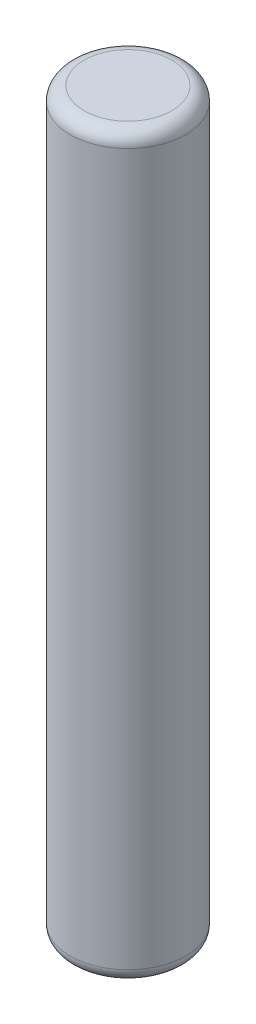
ISO-10303-21;
HEADER;
FILE_DESCRIPTION(('STEP AP214'),'2;1');
FILE_NAME('part.step','',(''),(''),'','','');
FILE_SCHEMA(('AUTOMOTIVE_DESIGN { 1 0 10303 214 1 1 1 1 }'));
ENDSEC;
DATA;
#1=APPLICATION_CONTEXT('core data for automotive mechanical design processes');
#2=APPLICATION_PROTOCOL_DEFINITION('international standard','automotive_design',2000,#1);
#3=PRODUCT_CONTEXT('',#1,'mechanical');
#4=PRODUCT('Part','Part','',(#3));
#5=PRODUCT_RELATED_PRODUCT_CATEGORY('part','',(#4));
#6=PRODUCT_DEFINITION_FORMATION('','',#4);
#7=PRODUCT_DEFINITION_CONTEXT('part definition',#1,'design');
#8=PRODUCT_DEFINITION('design','',#6,#7);
#9=PRODUCT_DEFINITION_SHAPE('','',#8);
#10=(LENGTH_UNIT() NAMED_UNIT(*) SI_UNIT(.MILLI.,.METRE.));
#11=(NAMED_UNIT(*) PLANE_ANGLE_UNIT() SI_UNIT($,.RADIAN.));
#12=(NAMED_UNIT(*) SI_UNIT($,.STERADIAN.) SOLID_ANGLE_UNIT());
#13=UNCERTAINTY_MEASURE_WITH_UNIT(LENGTH_MEASURE(1.E-05),#10,'distance_accuracy_value','');
#14=(GEOMETRIC_REPRESENTATION_CONTEXT(3) GLOBAL_UNCERTAINTY_ASSIGNED_CONTEXT((#13)) GLOBAL_UNIT_ASSIGNED_CONTEXT((#10,
#11,#12)) REPRESENTATION_CONTEXT('',''));
#15=CARTESIAN_POINT('',(0.,0.,0.));
#16=DIRECTION('',(0.,0.,1.));
#17=DIRECTION('',(1.,0.,0.));
#18=AXIS2_PLACEMENT_3D('',#15,#16,#17);
#19=CARTESIAN_POINT('',(0.,16.,0.));
#20=DIRECTION('',(0.,-1.,0.));
#21=DIRECTION('',(0.,0.,-1.));
#22=AXIS2_PLACEMENT_3D('',#19,#20,#21);
#23=CYLINDRICAL_SURFACE('',#22,1.25);
#24=CARTESIAN_POINT('',(0.,0.300000000000002,0.));
#25=DIRECTION('',(0.,1.,0.));
#26=DIRECTION('',(0.,0.,1.));
#27=AXIS2_PLACEMENT_3D('',#24,#25,#26);
#28=CIRCLE('',#27,1.25);
#29=CARTESIAN_POINT('',(0.,0.300000000000002,1.25));
#30=VERTEX_POINT('',#29);
#31=EDGE_CURVE('E42',#30,#30,#28,.T.);
#32=ORIENTED_EDGE('',*,*,#31,.T.);
#33=EDGE_LOOP('',(#32));
#34=FACE_BOUND('',#33,.T.);
#35=CARTESIAN_POINT('',(0.,15.7,0.));
#36=DIRECTION('',(0.,1.,0.));
#37=DIRECTION('',(0.,0.,1.));
#38=AXIS2_PLACEMENT_3D('',#35,#36,#37);
#39=CIRCLE('',#38,1.25);
#40=CARTESIAN_POINT('',(0.,15.7,1.25));
#41=VERTEX_POINT('',#40);
#42=EDGE_CURVE('E46',#41,#41,#39,.F.);
#43=ORIENTED_EDGE('',*,*,#42,.T.);
#44=EDGE_LOOP('',(#43));
#45=FACE_BOUND('',#44,.T.);
#46=ADVANCED_FACE('F31',(#34,#45),#23,.T.);
#47=CARTESIAN_POINT('',(0.,16.,0.));
#48=DIRECTION('',(0.,1.,0.));
#49=DIRECTION('',(0.,0.,1.));
#50=AXIS2_PLACEMENT_3D('',#47,#48,#49);
#51=PLANE('',#50);
#52=CARTESIAN_POINT('',(0.,16.,0.));
#53=DIRECTION('',(0.,1.,0.));
#54=DIRECTION('',(0.,0.,1.));
#55=AXIS2_PLACEMENT_3D('',#52,#53,#54);
#56=CIRCLE('',#55,0.95);
#57=CARTESIAN_POINT('',(0.,16.,0.95));
#58=VERTEX_POINT('',#57);
#59=EDGE_CURVE('E10',#58,#58,#56,.T.);
#60=ORIENTED_EDGE('',*,*,#59,.T.);
#61=EDGE_LOOP('',(#60));
#62=FACE_BOUND('',#61,.T.);
#63=ADVANCED_FACE('F62',(#62),#51,.T.);
#64=CARTESIAN_POINT('',(0.,0.,0.));
#65=DIRECTION('',(0.,1.,0.));
#66=DIRECTION('',(0.,0.,1.));
#67=AXIS2_PLACEMENT_3D('',#64,#65,#66);
#68=PLANE('',#67);
#69=CARTESIAN_POINT('',(0.,0.,0.));
#70=DIRECTION('',(0.,1.,0.));
#71=DIRECTION('',(0.,0.,1.));
#72=AXIS2_PLACEMENT_3D('',#69,#70,#71);
#73=CIRCLE('',#72,0.95);
#74=CARTESIAN_POINT('',(0.,0.,0.95));
#75=VERTEX_POINT('',#74);
#76=EDGE_CURVE('E38',#75,#75,#73,.F.);
#77=ORIENTED_EDGE('',*,*,#76,.T.);
#78=EDGE_LOOP('',(#77));
#79=FACE_BOUND('',#78,.T.);
#80=ADVANCED_FACE('F59',(#79),#68,.F.);
#81=CARTESIAN_POINT('',(0.,0.300000000000002,0.));
#82=DIRECTION('',(0.,1.,0.));
#83=DIRECTION('',(0.,0.,1.));
#84=AXIS2_PLACEMENT_3D('',#81,#82,#83);
#85=TOROIDAL_SURFACE('',#84,0.95,0.3);
#86=ORIENTED_EDGE('',*,*,#76,.F.);
#87=EDGE_LOOP('',(#86));
#88=FACE_BOUND('',#87,.T.);
#89=ORIENTED_EDGE('',*,*,#31,.F.);
#90=EDGE_LOOP('',(#89));
#91=FACE_BOUND('',#90,.T.);
#92=ADVANCED_FACE('F55',(#88,#91),#85,.T.);
#93=CARTESIAN_POINT('',(0.,15.7,0.));
#94=DIRECTION('',(0.,1.,0.));
#95=DIRECTION('',(0.,0.,1.));
#96=AXIS2_PLACEMENT_3D('',#93,#94,#95);
#97=TOROIDAL_SURFACE('',#96,0.95,0.3);
#98=ORIENTED_EDGE('',*,*,#42,.F.);
#99=EDGE_LOOP('',(#98));
#100=FACE_BOUND('',#99,.T.);
#101=ORIENTED_EDGE('',*,*,#59,.F.);
#102=EDGE_LOOP('',(#101));
#103=FACE_BOUND('',#102,.T.);
#104=ADVANCED_FACE('F33',(#100,#103),#97,.T.);
#105=CLOSED_SHELL('',(#46,#63,#80,#92,#104));
#106=MANIFOLD_SOLID_BREP('B2',#105);
#107=ADVANCED_BREP_SHAPE_REPRESENTATION('',(#18,#106),#14);
#108=SHAPE_DEFINITION_REPRESENTATION(#9,#107);
ENDSEC;
END-ISO-10303-21;
